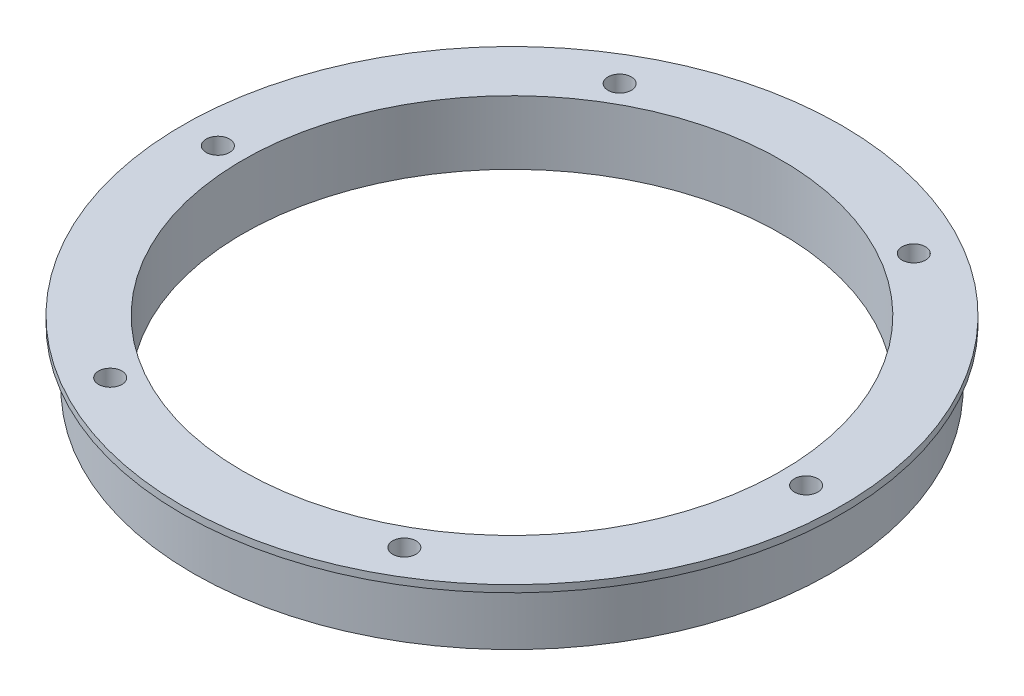
ISO-10303-21;
HEADER;
FILE_DESCRIPTION(('STEP AP214'),'2;1');
FILE_NAME('part.step','',(''),(''),'','','');
FILE_SCHEMA(('AUTOMOTIVE_DESIGN { 1 0 10303 214 1 1 1 1 }'));
ENDSEC;
DATA;
#1=APPLICATION_CONTEXT('core data for automotive mechanical design processes');
#2=APPLICATION_PROTOCOL_DEFINITION('international standard','automotive_design',2000,#1);
#3=PRODUCT_CONTEXT('',#1,'mechanical');
#4=PRODUCT('Part','Part','',(#3));
#5=PRODUCT_RELATED_PRODUCT_CATEGORY('part','',(#4));
#6=PRODUCT_DEFINITION_FORMATION('','',#4);
#7=PRODUCT_DEFINITION_CONTEXT('part definition',#1,'design');
#8=PRODUCT_DEFINITION('design','',#6,#7);
#9=PRODUCT_DEFINITION_SHAPE('','',#8);
#10=(LENGTH_UNIT() NAMED_UNIT(*) SI_UNIT(.MILLI.,.METRE.));
#11=(NAMED_UNIT(*) PLANE_ANGLE_UNIT() SI_UNIT($,.RADIAN.));
#12=(NAMED_UNIT(*) SI_UNIT($,.STERADIAN.) SOLID_ANGLE_UNIT());
#13=UNCERTAINTY_MEASURE_WITH_UNIT(LENGTH_MEASURE(1.E-05),#10,'distance_accuracy_value','');
#14=(GEOMETRIC_REPRESENTATION_CONTEXT(3) GLOBAL_UNCERTAINTY_ASSIGNED_CONTEXT((#13)) GLOBAL_UNIT_ASSIGNED_CONTEXT((#10,
#11,#12)) REPRESENTATION_CONTEXT('',''));
#15=CARTESIAN_POINT('',(0.,0.,0.));
#16=DIRECTION('',(0.,0.,1.));
#17=DIRECTION('',(1.,0.,0.));
#18=AXIS2_PLACEMENT_3D('',#15,#16,#17);
#19=CARTESIAN_POINT('',(0.,0.,0.));
#20=DIRECTION('',(0.,1.,0.));
#21=DIRECTION('',(0.,0.,1.));
#22=AXIS2_PLACEMENT_3D('',#19,#20,#21);
#23=PLANE('',#22);
#24=CARTESIAN_POINT('',(-20.75,0.,-35.9400542570542));
#25=DIRECTION('',(0.,1.,0.));
#26=DIRECTION('',(0.,0.,1.));
#27=AXIS2_PLACEMENT_3D('',#24,#25,#26);
#28=CIRCLE('',#27,1.65);
#29=CARTESIAN_POINT('',(-20.75,0.,-34.2900542570542));
#30=VERTEX_POINT('',#29);
#31=EDGE_CURVE('E89',#30,#30,#28,.T.);
#32=ORIENTED_EDGE('',*,*,#31,.T.);
#33=EDGE_LOOP('',(#32));
#34=FACE_BOUND('',#33,.T.);
#35=CARTESIAN_POINT('',(20.75,0.,-35.9400542570542));
#36=DIRECTION('',(0.,1.,0.));
#37=DIRECTION('',(0.,0.,1.));
#38=AXIS2_PLACEMENT_3D('',#35,#36,#37);
#39=CIRCLE('',#38,1.65);
#40=CARTESIAN_POINT('',(20.75,0.,-34.2900542570542));
#41=VERTEX_POINT('',#40);
#42=EDGE_CURVE('E83',#41,#41,#39,.T.);
#43=ORIENTED_EDGE('',*,*,#42,.T.);
#44=EDGE_LOOP('',(#43));
#45=FACE_BOUND('',#44,.T.);
#46=CARTESIAN_POINT('',(41.5,0.,0.));
#47=DIRECTION('',(0.,1.,0.));
#48=DIRECTION('',(0.,0.,1.));
#49=AXIS2_PLACEMENT_3D('',#46,#47,#48);
#50=CIRCLE('',#49,1.65);
#51=CARTESIAN_POINT('',(41.5,0.,1.64999999999999));
#52=VERTEX_POINT('',#51);
#53=EDGE_CURVE('E77',#52,#52,#50,.T.);
#54=ORIENTED_EDGE('',*,*,#53,.T.);
#55=EDGE_LOOP('',(#54));
#56=FACE_BOUND('',#55,.T.);
#57=CARTESIAN_POINT('',(20.75,0.,35.9400542570542));
#58=DIRECTION('',(0.,1.,0.));
#59=DIRECTION('',(0.,0.,1.));
#60=AXIS2_PLACEMENT_3D('',#57,#58,#59);
#61=CIRCLE('',#60,1.65);
#62=CARTESIAN_POINT('',(20.75,0.,37.5900542570542));
#63=VERTEX_POINT('',#62);
#64=EDGE_CURVE('E71',#63,#63,#61,.T.);
#65=ORIENTED_EDGE('',*,*,#64,.T.);
#66=EDGE_LOOP('',(#65));
#67=FACE_BOUND('',#66,.T.);
#68=CARTESIAN_POINT('',(-20.75,0.,35.9400542570542));
#69=DIRECTION('',(0.,1.,0.));
#70=DIRECTION('',(0.,0.,1.));
#71=AXIS2_PLACEMENT_3D('',#68,#69,#70);
#72=CIRCLE('',#71,1.65);
#73=CARTESIAN_POINT('',(-20.75,0.,37.5900542570542));
#74=VERTEX_POINT('',#73);
#75=EDGE_CURVE('E65',#74,#74,#72,.T.);
#76=ORIENTED_EDGE('',*,*,#75,.T.);
#77=EDGE_LOOP('',(#76));
#78=FACE_BOUND('',#77,.T.);
#79=CARTESIAN_POINT('',(-41.5,0.,0.));
#80=DIRECTION('',(0.,1.,0.));
#81=DIRECTION('',(0.,0.,1.));
#82=AXIS2_PLACEMENT_3D('',#79,#80,#81);
#83=CIRCLE('',#82,1.65);
#84=CARTESIAN_POINT('',(-41.5,0.,1.64999999999999));
#85=VERTEX_POINT('',#84);
#86=EDGE_CURVE('E59',#85,#85,#83,.T.);
#87=ORIENTED_EDGE('',*,*,#86,.T.);
#88=EDGE_LOOP('',(#87));
#89=FACE_BOUND('',#88,.T.);
#90=CARTESIAN_POINT('',(0.,0.,0.));
#91=DIRECTION('',(0.,1.,0.));
#92=DIRECTION('',(0.,0.,1.));
#93=AXIS2_PLACEMENT_3D('',#90,#91,#92);
#94=CIRCLE('',#93,45.);
#95=CARTESIAN_POINT('',(0.,0.,45.));
#96=VERTEX_POINT('',#95);
#97=EDGE_CURVE('E39',#96,#96,#94,.T.);
#98=ORIENTED_EDGE('',*,*,#97,.F.);
#99=EDGE_LOOP('',(#98));
#100=FACE_BOUND('',#99,.T.);
#101=CARTESIAN_POINT('',(0.,0.,0.));
#102=DIRECTION('',(0.,1.,0.));
#103=DIRECTION('',(0.,0.,1.));
#104=AXIS2_PLACEMENT_3D('',#101,#102,#103);
#105=CIRCLE('',#104,38.);
#106=CARTESIAN_POINT('',(0.,0.,38.));
#107=VERTEX_POINT('',#106);
#108=EDGE_CURVE('E46',#107,#107,#105,.T.);
#109=ORIENTED_EDGE('',*,*,#108,.T.);
#110=EDGE_LOOP('',(#109));
#111=FACE_BOUND('',#110,.T.);
#112=ADVANCED_FACE('F35',(#34,#45,#56,#67,#78,#89,#100,#111),#23,.F.);
#113=CARTESIAN_POINT('',(0.,8.,0.));
#114=DIRECTION('',(0.,-1.,0.));
#115=DIRECTION('',(0.,0.,-1.));
#116=AXIS2_PLACEMENT_3D('',#113,#114,#115);
#117=CYLINDRICAL_SURFACE('',#116,45.);
#118=CARTESIAN_POINT('',(0.,8.,0.));
#119=DIRECTION('',(0.,1.,0.));
#120=DIRECTION('',(0.,0.,1.));
#121=AXIS2_PLACEMENT_3D('',#118,#119,#120);
#122=CIRCLE('',#121,45.);
#123=CARTESIAN_POINT('',(0.,8.,45.));
#124=VERTEX_POINT('',#123);
#125=EDGE_CURVE('E10',#124,#124,#122,.T.);
#126=ORIENTED_EDGE('',*,*,#125,.F.);
#127=EDGE_LOOP('',(#126));
#128=FACE_BOUND('',#127,.T.);
#129=ORIENTED_EDGE('',*,*,#97,.T.);
#130=EDGE_LOOP('',(#129));
#131=FACE_BOUND('',#130,.T.);
#132=ADVANCED_FACE('F37',(#128,#131),#117,.T.);
#133=CARTESIAN_POINT('',(0.,8.,0.));
#134=DIRECTION('',(0.,-1.,0.));
#135=DIRECTION('',(0.,0.,-1.));
#136=AXIS2_PLACEMENT_3D('',#133,#134,#135);
#137=CYLINDRICAL_SURFACE('',#136,38.);
#138=ORIENTED_EDGE('',*,*,#108,.F.);
#139=EDGE_LOOP('',(#138));
#140=FACE_BOUND('',#139,.T.);
#141=CARTESIAN_POINT('',(0.,9.,0.));
#142=DIRECTION('',(0.,1.,0.));
#143=DIRECTION('',(0.,0.,1.));
#144=AXIS2_PLACEMENT_3D('',#141,#142,#143);
#145=CIRCLE('',#144,38.);
#146=CARTESIAN_POINT('',(0.,9.,38.));
#147=VERTEX_POINT('',#146);
#148=EDGE_CURVE('E54',#147,#147,#145,.T.);
#149=ORIENTED_EDGE('',*,*,#148,.T.);
#150=EDGE_LOOP('',(#149));
#151=FACE_BOUND('',#150,.T.);
#152=ADVANCED_FACE('F102',(#140,#151),#137,.F.);
#153=CARTESIAN_POINT('',(0.,9.,0.));
#154=DIRECTION('',(0.,1.,0.));
#155=DIRECTION('',(0.,0.,1.));
#156=AXIS2_PLACEMENT_3D('',#153,#154,#155);
#157=PLANE('',#156);
#158=CARTESIAN_POINT('',(-20.75,9.,-35.9400542570542));
#159=DIRECTION('',(0.,1.,0.));
#160=DIRECTION('',(0.,0.,1.));
#161=AXIS2_PLACEMENT_3D('',#158,#159,#160);
#162=CIRCLE('',#161,1.64999999999999);
#163=CARTESIAN_POINT('',(-20.75,9.,-34.2900542570542));
#164=VERTEX_POINT('',#163);
#165=EDGE_CURVE('E92',#164,#164,#162,.T.);
#166=ORIENTED_EDGE('',*,*,#165,.F.);
#167=EDGE_LOOP('',(#166));
#168=FACE_BOUND('',#167,.T.);
#169=CARTESIAN_POINT('',(20.75,9.,-35.9400542570542));
#170=DIRECTION('',(0.,1.,0.));
#171=DIRECTION('',(0.,0.,1.));
#172=AXIS2_PLACEMENT_3D('',#169,#170,#171);
#173=CIRCLE('',#172,1.64999999999999);
#174=CARTESIAN_POINT('',(20.75,9.,-34.2900542570542));
#175=VERTEX_POINT('',#174);
#176=EDGE_CURVE('E86',#175,#175,#173,.T.);
#177=ORIENTED_EDGE('',*,*,#176,.F.);
#178=EDGE_LOOP('',(#177));
#179=FACE_BOUND('',#178,.T.);
#180=CARTESIAN_POINT('',(41.5,9.,0.));
#181=DIRECTION('',(0.,1.,0.));
#182=DIRECTION('',(0.,0.,1.));
#183=AXIS2_PLACEMENT_3D('',#180,#181,#182);
#184=CIRCLE('',#183,1.64999999999999);
#185=CARTESIAN_POINT('',(41.5,9.,1.64999999999999));
#186=VERTEX_POINT('',#185);
#187=EDGE_CURVE('E80',#186,#186,#184,.T.);
#188=ORIENTED_EDGE('',*,*,#187,.F.);
#189=EDGE_LOOP('',(#188));
#190=FACE_BOUND('',#189,.T.);
#191=CARTESIAN_POINT('',(20.75,9.,35.9400542570542));
#192=DIRECTION('',(0.,1.,0.));
#193=DIRECTION('',(0.,0.,1.));
#194=AXIS2_PLACEMENT_3D('',#191,#192,#193);
#195=CIRCLE('',#194,1.64999999999999);
#196=CARTESIAN_POINT('',(20.75,9.,37.5900542570542));
#197=VERTEX_POINT('',#196);
#198=EDGE_CURVE('E74',#197,#197,#195,.T.);
#199=ORIENTED_EDGE('',*,*,#198,.F.);
#200=EDGE_LOOP('',(#199));
#201=FACE_BOUND('',#200,.T.);
#202=CARTESIAN_POINT('',(-20.75,9.,35.9400542570542));
#203=DIRECTION('',(0.,1.,0.));
#204=DIRECTION('',(0.,0.,1.));
#205=AXIS2_PLACEMENT_3D('',#202,#203,#204);
#206=CIRCLE('',#205,1.64999999999999);
#207=CARTESIAN_POINT('',(-20.75,9.,37.5900542570542));
#208=VERTEX_POINT('',#207);
#209=EDGE_CURVE('E68',#208,#208,#206,.T.);
#210=ORIENTED_EDGE('',*,*,#209,.F.);
#211=EDGE_LOOP('',(#210));
#212=FACE_BOUND('',#211,.T.);
#213=CARTESIAN_POINT('',(-41.5,9.,0.));
#214=DIRECTION('',(0.,1.,0.));
#215=DIRECTION('',(0.,0.,1.));
#216=AXIS2_PLACEMENT_3D('',#213,#214,#215);
#217=CIRCLE('',#216,1.64999999999998);
#218=CARTESIAN_POINT('',(-41.5,9.,1.64999999999998));
#219=VERTEX_POINT('',#218);
#220=EDGE_CURVE('E62',#219,#219,#217,.T.);
#221=ORIENTED_EDGE('',*,*,#220,.F.);
#222=EDGE_LOOP('',(#221));
#223=FACE_BOUND('',#222,.T.);
#224=CARTESIAN_POINT('',(0.,9.,0.));
#225=DIRECTION('',(0.,1.,0.));
#226=DIRECTION('',(0.,0.,1.));
#227=AXIS2_PLACEMENT_3D('',#224,#225,#226);
#228=CIRCLE('',#227,46.5);
#229=CARTESIAN_POINT('',(0.,9.,46.5));
#230=VERTEX_POINT('',#229);
#231=EDGE_CURVE('E50',#230,#230,#228,.T.);
#232=ORIENTED_EDGE('',*,*,#231,.T.);
#233=EDGE_LOOP('',(#232));
#234=FACE_BOUND('',#233,.T.);
#235=ORIENTED_EDGE('',*,*,#148,.F.);
#236=EDGE_LOOP('',(#235));
#237=FACE_BOUND('',#236,.T.);
#238=ADVANCED_FACE('F98',(#168,#179,#190,#201,#212,#223,#234,#237),#157,.T.);
#239=CARTESIAN_POINT('',(0.,8.,0.));
#240=DIRECTION('',(0.,1.,0.));
#241=DIRECTION('',(0.,0.,1.));
#242=AXIS2_PLACEMENT_3D('',#239,#240,#241);
#243=PLANE('',#242);
#244=ORIENTED_EDGE('',*,*,#125,.T.);
#245=EDGE_LOOP('',(#244));
#246=FACE_BOUND('',#245,.T.);
#247=CARTESIAN_POINT('',(0.,8.,0.));
#248=DIRECTION('',(0.,1.,0.));
#249=DIRECTION('',(0.,0.,1.));
#250=AXIS2_PLACEMENT_3D('',#247,#248,#249);
#251=CIRCLE('',#250,46.5);
#252=CARTESIAN_POINT('',(0.,8.,46.5));
#253=VERTEX_POINT('',#252);
#254=EDGE_CURVE('E51',#253,#253,#251,.T.);
#255=ORIENTED_EDGE('',*,*,#254,.F.);
#256=EDGE_LOOP('',(#255));
#257=FACE_BOUND('',#256,.T.);
#258=ADVANCED_FACE('F101',(#246,#257),#243,.F.);
#259=CARTESIAN_POINT('',(0.,9.,0.));
#260=DIRECTION('',(0.,-1.,0.));
#261=DIRECTION('',(0.,0.,-1.));
#262=AXIS2_PLACEMENT_3D('',#259,#260,#261);
#263=CYLINDRICAL_SURFACE('',#262,46.5);
#264=ORIENTED_EDGE('',*,*,#231,.F.);
#265=EDGE_LOOP('',(#264));
#266=FACE_BOUND('',#265,.T.);
#267=ORIENTED_EDGE('',*,*,#254,.T.);
#268=EDGE_LOOP('',(#267));
#269=FACE_BOUND('',#268,.T.);
#270=ADVANCED_FACE('F151',(#266,#269),#263,.T.);
#271=CARTESIAN_POINT('',(-41.5,9.,0.));
#272=DIRECTION('',(0.,1.,0.));
#273=DIRECTION('',(0.,0.,1.));
#274=AXIS2_PLACEMENT_3D('',#271,#272,#273);
#275=CYLINDRICAL_SURFACE('',#274,1.64999999999999);
#276=ORIENTED_EDGE('',*,*,#86,.F.);
#277=EDGE_LOOP('',(#276));
#278=FACE_BOUND('',#277,.T.);
#279=ORIENTED_EDGE('',*,*,#220,.T.);
#280=EDGE_LOOP('',(#279));
#281=FACE_BOUND('',#280,.T.);
#282=ADVANCED_FACE('F147',(#278,#281),#275,.F.);
#283=CARTESIAN_POINT('',(-20.75,9.,35.9400542570542));
#284=DIRECTION('',(0.,1.,0.));
#285=DIRECTION('',(0.,0.,1.));
#286=AXIS2_PLACEMENT_3D('',#283,#284,#285);
#287=CYLINDRICAL_SURFACE('',#286,1.64999999999999);
#288=ORIENTED_EDGE('',*,*,#75,.F.);
#289=EDGE_LOOP('',(#288));
#290=FACE_BOUND('',#289,.T.);
#291=ORIENTED_EDGE('',*,*,#209,.T.);
#292=EDGE_LOOP('',(#291));
#293=FACE_BOUND('',#292,.T.);
#294=ADVANCED_FACE('F150',(#290,#293),#287,.F.);
#295=CARTESIAN_POINT('',(20.75,9.,35.9400542570542));
#296=DIRECTION('',(0.,1.,0.));
#297=DIRECTION('',(0.,0.,1.));
#298=AXIS2_PLACEMENT_3D('',#295,#296,#297);
#299=CYLINDRICAL_SURFACE('',#298,1.64999999999999);
#300=ORIENTED_EDGE('',*,*,#64,.F.);
#301=EDGE_LOOP('',(#300));
#302=FACE_BOUND('',#301,.T.);
#303=ORIENTED_EDGE('',*,*,#198,.T.);
#304=EDGE_LOOP('',(#303));
#305=FACE_BOUND('',#304,.T.);
#306=ADVANCED_FACE('F157',(#302,#305),#299,.F.);
#307=CARTESIAN_POINT('',(41.5,9.,0.));
#308=DIRECTION('',(0.,1.,0.));
#309=DIRECTION('',(0.,0.,1.));
#310=AXIS2_PLACEMENT_3D('',#307,#308,#309);
#311=CYLINDRICAL_SURFACE('',#310,1.65);
#312=ORIENTED_EDGE('',*,*,#53,.F.);
#313=EDGE_LOOP('',(#312));
#314=FACE_BOUND('',#313,.T.);
#315=ORIENTED_EDGE('',*,*,#187,.T.);
#316=EDGE_LOOP('',(#315));
#317=FACE_BOUND('',#316,.T.);
#318=ADVANCED_FACE('F209',(#314,#317),#311,.F.);
#319=CARTESIAN_POINT('',(20.75,9.,-35.9400542570542));
#320=DIRECTION('',(0.,1.,0.));
#321=DIRECTION('',(0.,0.,1.));
#322=AXIS2_PLACEMENT_3D('',#319,#320,#321);
#323=CYLINDRICAL_SURFACE('',#322,1.64999999999999);
#324=ORIENTED_EDGE('',*,*,#42,.F.);
#325=EDGE_LOOP('',(#324));
#326=FACE_BOUND('',#325,.T.);
#327=ORIENTED_EDGE('',*,*,#176,.T.);
#328=EDGE_LOOP('',(#327));
#329=FACE_BOUND('',#328,.T.);
#330=ADVANCED_FACE('F219',(#326,#329),#323,.F.);
#331=CARTESIAN_POINT('',(-20.75,9.,-35.9400542570542));
#332=DIRECTION('',(0.,1.,0.));
#333=DIRECTION('',(0.,0.,1.));
#334=AXIS2_PLACEMENT_3D('',#331,#332,#333);
#335=CYLINDRICAL_SURFACE('',#334,1.64999999999999);
#336=ORIENTED_EDGE('',*,*,#31,.F.);
#337=EDGE_LOOP('',(#336));
#338=FACE_BOUND('',#337,.T.);
#339=ORIENTED_EDGE('',*,*,#165,.T.);
#340=EDGE_LOOP('',(#339));
#341=FACE_BOUND('',#340,.T.);
#342=ADVANCED_FACE('F96',(#338,#341),#335,.F.);
#343=CLOSED_SHELL('',(#112,#132,#152,#238,#258,#270,#282,#294,#306,#318,#330,#342));
#344=MANIFOLD_SOLID_BREP('B2',#343);
#345=ADVANCED_BREP_SHAPE_REPRESENTATION('',(#18,#344),#14);
#346=SHAPE_DEFINITION_REPRESENTATION(#9,#345);
ENDSEC;
END-ISO-10303-21;
